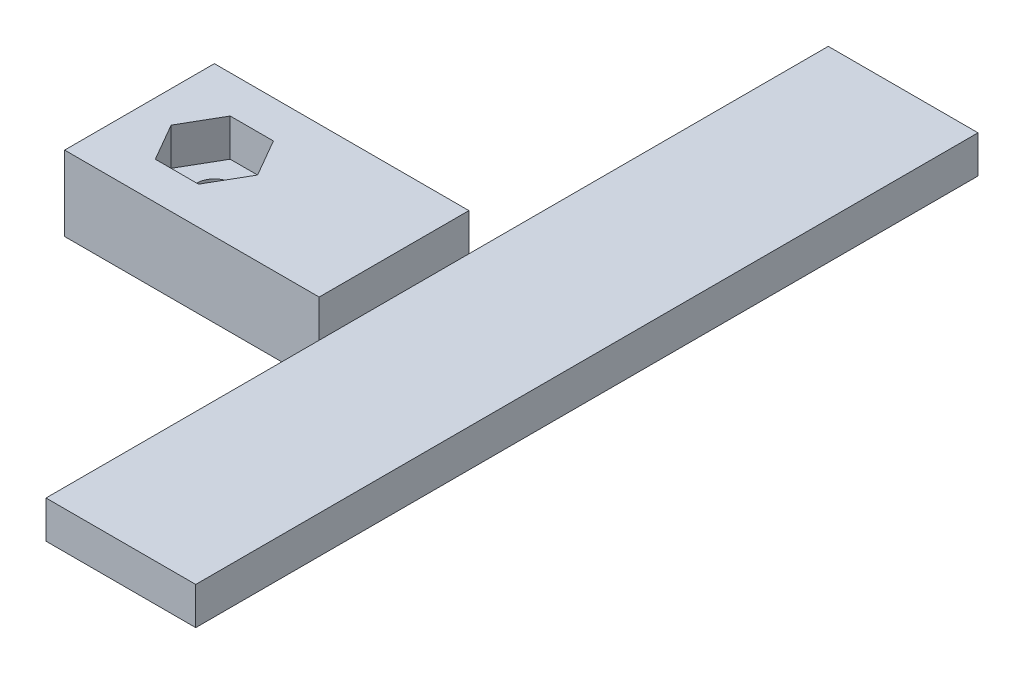
ISO-10303-21;
HEADER;
FILE_DESCRIPTION(('STEP AP214'),'2;1');
FILE_NAME('part.step','',(''),(''),'','','');
FILE_SCHEMA(('AUTOMOTIVE_DESIGN { 1 0 10303 214 1 1 1 1 }'));
ENDSEC;
DATA;
#1=APPLICATION_CONTEXT('core data for automotive mechanical design processes');
#2=APPLICATION_PROTOCOL_DEFINITION('international standard','automotive_design',2000,#1);
#3=PRODUCT_CONTEXT('',#1,'mechanical');
#4=PRODUCT('Part','Part','',(#3));
#5=PRODUCT_RELATED_PRODUCT_CATEGORY('part','',(#4));
#6=PRODUCT_DEFINITION_FORMATION('','',#4);
#7=PRODUCT_DEFINITION_CONTEXT('part definition',#1,'design');
#8=PRODUCT_DEFINITION('design','',#6,#7);
#9=PRODUCT_DEFINITION_SHAPE('','',#8);
#10=(LENGTH_UNIT() NAMED_UNIT(*) SI_UNIT(.MILLI.,.METRE.));
#11=(NAMED_UNIT(*) PLANE_ANGLE_UNIT() SI_UNIT($,.RADIAN.));
#12=(NAMED_UNIT(*) SI_UNIT($,.STERADIAN.) SOLID_ANGLE_UNIT());
#13=UNCERTAINTY_MEASURE_WITH_UNIT(LENGTH_MEASURE(1.E-05),#10,'distance_accuracy_value','');
#14=(GEOMETRIC_REPRESENTATION_CONTEXT(3) GLOBAL_UNCERTAINTY_ASSIGNED_CONTEXT((#13)) GLOBAL_UNIT_ASSIGNED_CONTEXT((#10,
#11,#12)) REPRESENTATION_CONTEXT('',''));
#15=CARTESIAN_POINT('',(0.,0.,0.));
#16=DIRECTION('',(0.,0.,1.));
#17=DIRECTION('',(1.,0.,0.));
#18=AXIS2_PLACEMENT_3D('',#15,#16,#17);
#19=CARTESIAN_POINT('',(4.44500000000001,3.175,0.));
#20=DIRECTION('',(1.,0.,0.));
#21=DIRECTION('',(0.,0.,-1.));
#22=AXIS2_PLACEMENT_3D('',#19,#20,#21);
#23=PLANE('',#22);
#24=DIRECTION('',(0.,0.,1.));
#25=VECTOR('',#24,1.);
#26=CARTESIAN_POINT('',(4.44500000000001,0.,0.));
#27=LINE('',#26,#25);
#28=CARTESIAN_POINT('',(4.44500000000001,0.,-6.35));
#29=VERTEX_POINT('',#28);
#30=CARTESIAN_POINT('',(4.44500000000001,0.,6.35));
#31=VERTEX_POINT('',#30);
#32=EDGE_CURVE('E214',#29,#31,#27,.T.);
#33=ORIENTED_EDGE('',*,*,#32,.F.);
#34=DIRECTION('',(0.,-1.,0.));
#35=VECTOR('',#34,1.);
#36=CARTESIAN_POINT('',(4.44500000000001,3.175,-6.35));
#37=LINE('',#36,#35);
#38=CARTESIAN_POINT('',(4.44500000000001,3.175,-6.35));
#39=VERTEX_POINT('',#38);
#40=EDGE_CURVE('E12',#39,#29,#37,.T.);
#41=ORIENTED_EDGE('',*,*,#40,.F.);
#42=DIRECTION('',(0.,0.,1.));
#43=VECTOR('',#42,1.);
#44=CARTESIAN_POINT('',(4.44500000000001,3.175,0.));
#45=LINE('',#44,#43);
#46=CARTESIAN_POINT('',(4.44500000000001,3.175,6.35));
#47=VERTEX_POINT('',#46);
#48=EDGE_CURVE('E165',#39,#47,#45,.T.);
#49=ORIENTED_EDGE('',*,*,#48,.T.);
#50=DIRECTION('',(0.,-1.,0.));
#51=VECTOR('',#50,1.);
#52=CARTESIAN_POINT('',(4.44500000000001,3.175,6.35));
#53=LINE('',#52,#51);
#54=EDGE_CURVE('E100',#47,#31,#53,.T.);
#55=ORIENTED_EDGE('',*,*,#54,.T.);
#56=EDGE_LOOP('',(#33,#41,#49,#55));
#57=FACE_BOUND('',#56,.T.);
#58=ADVANCED_FACE('F80',(#57),#23,.T.);
#59=CARTESIAN_POINT('',(0.,3.175,-6.35));
#60=DIRECTION('',(0.,0.,1.));
#61=DIRECTION('',(1.,0.,0.));
#62=AXIS2_PLACEMENT_3D('',#59,#60,#61);
#63=PLANE('',#62);
#64=ORIENTED_EDGE('',*,*,#40,.T.);
#65=DIRECTION('',(0.,1.,0.));
#66=VECTOR('',#65,1.);
#67=CARTESIAN_POINT('',(4.44500000000001,-3.175,-6.35));
#68=LINE('',#67,#66);
#69=CARTESIAN_POINT('',(4.44500000000001,-3.175,-6.35));
#70=VERTEX_POINT('',#69);
#71=EDGE_CURVE('E291',#70,#29,#68,.T.);
#72=ORIENTED_EDGE('',*,*,#71,.F.);
#73=DIRECTION('',(-1.,0.,0.));
#74=VECTOR('',#73,1.);
#75=CARTESIAN_POINT('',(17.145,-3.175,-6.35));
#76=LINE('',#75,#74);
#77=CARTESIAN_POINT('',(-17.145,-3.175,-6.35));
#78=VERTEX_POINT('',#77);
#79=EDGE_CURVE('E173',#70,#78,#76,.T.);
#80=ORIENTED_EDGE('',*,*,#79,.T.);
#81=DIRECTION('',(0.,-1.,0.));
#82=VECTOR('',#81,1.);
#83=CARTESIAN_POINT('',(-17.145,3.175,-6.35));
#84=LINE('',#83,#82);
#85=CARTESIAN_POINT('',(-17.145,3.175,-6.35));
#86=VERTEX_POINT('',#85);
#87=EDGE_CURVE('E91',#86,#78,#84,.T.);
#88=ORIENTED_EDGE('',*,*,#87,.F.);
#89=DIRECTION('',(-1.,0.,0.));
#90=VECTOR('',#89,1.);
#91=CARTESIAN_POINT('',(0.,3.175,-6.35));
#92=LINE('',#91,#90);
#93=EDGE_CURVE('E159',#39,#86,#92,.T.);
#94=ORIENTED_EDGE('',*,*,#93,.F.);
#95=EDGE_LOOP('',(#64,#72,#80,#88,#94));
#96=FACE_BOUND('',#95,.T.);
#97=ADVANCED_FACE('F170',(#96),#63,.F.);
#98=CARTESIAN_POINT('',(-17.145,3.175,0.));
#99=DIRECTION('',(-1.,0.,0.));
#100=DIRECTION('',(0.,0.,1.));
#101=AXIS2_PLACEMENT_3D('',#98,#99,#100);
#102=PLANE('',#101);
#103=ORIENTED_EDGE('',*,*,#87,.T.);
#104=DIRECTION('',(0.,0.,-1.));
#105=VECTOR('',#104,1.);
#106=CARTESIAN_POINT('',(-17.145,-3.175,6.35));
#107=LINE('',#106,#105);
#108=CARTESIAN_POINT('',(-17.145,-3.175,6.35));
#109=VERTEX_POINT('',#108);
#110=EDGE_CURVE('E286',#109,#78,#107,.T.);
#111=ORIENTED_EDGE('',*,*,#110,.F.);
#112=DIRECTION('',(0.,-1.,0.));
#113=VECTOR('',#112,1.);
#114=CARTESIAN_POINT('',(-17.145,3.175,6.35));
#115=LINE('',#114,#113);
#116=CARTESIAN_POINT('',(-17.145,3.175,6.35));
#117=VERTEX_POINT('',#116);
#118=EDGE_CURVE('E178',#117,#109,#115,.T.);
#119=ORIENTED_EDGE('',*,*,#118,.F.);
#120=DIRECTION('',(0.,0.,-1.));
#121=VECTOR('',#120,1.);
#122=CARTESIAN_POINT('',(-17.145,3.175,0.));
#123=LINE('',#122,#121);
#124=EDGE_CURVE('E164',#117,#86,#123,.T.);
#125=ORIENTED_EDGE('',*,*,#124,.T.);
#126=EDGE_LOOP('',(#103,#111,#119,#125));
#127=FACE_BOUND('',#126,.T.);
#128=ADVANCED_FACE('F180',(#127),#102,.T.);
#129=CARTESIAN_POINT('',(0.,3.175,3.175));
#130=DIRECTION('',(0.,0.,-1.));
#131=DIRECTION('',(-1.,0.,0.));
#132=AXIS2_PLACEMENT_3D('',#129,#130,#131);
#133=PLANE('',#132);
#134=DIRECTION('',(1.,0.,0.));
#135=VECTOR('',#134,1.);
#136=CARTESIAN_POINT('',(0.,0.,3.175));
#137=LINE('',#136,#135);
#138=CARTESIAN_POINT('',(-12.628087104677,0.,3.175));
#139=VERTEX_POINT('',#138);
#140=CARTESIAN_POINT('',(-8.96191289532293,0.,3.175));
#141=VERTEX_POINT('',#140);
#142=EDGE_CURVE('E189',#139,#141,#137,.T.);
#143=ORIENTED_EDGE('',*,*,#142,.F.);
#144=DIRECTION('',(0.,-1.,0.));
#145=VECTOR('',#144,1.);
#146=CARTESIAN_POINT('',(-12.628087104677,3.175,3.175));
#147=LINE('',#146,#145);
#148=CARTESIAN_POINT('',(-12.628087104677,3.175,3.175));
#149=VERTEX_POINT('',#148);
#150=EDGE_CURVE('E84',#149,#139,#147,.T.);
#151=ORIENTED_EDGE('',*,*,#150,.F.);
#152=DIRECTION('',(1.,0.,0.));
#153=VECTOR('',#152,1.);
#154=CARTESIAN_POINT('',(0.,3.175,3.175));
#155=LINE('',#154,#153);
#156=CARTESIAN_POINT('',(-8.96191289532293,3.175,3.175));
#157=VERTEX_POINT('',#156);
#158=EDGE_CURVE('E218',#149,#157,#155,.T.);
#159=ORIENTED_EDGE('',*,*,#158,.T.);
#160=DIRECTION('',(0.,-1.,0.));
#161=VECTOR('',#160,1.);
#162=CARTESIAN_POINT('',(-8.96191289532293,3.175,3.175));
#163=LINE('',#162,#161);
#164=EDGE_CURVE('E125',#157,#141,#163,.T.);
#165=ORIENTED_EDGE('',*,*,#164,.T.);
#166=EDGE_LOOP('',(#143,#151,#159,#165));
#167=FACE_BOUND('',#166,.T.);
#168=ADVANCED_FACE('F82',(#167),#133,.T.);
#169=CARTESIAN_POINT('',(-10.8458806570156,3.175,6.2618721169265));
#170=DIRECTION('',(0.866025403784439,0.,-0.5));
#171=DIRECTION('',(-0.5,0.,-0.866025403784439));
#172=AXIS2_PLACEMENT_3D('',#169,#170,#171);
#173=PLANE('',#172);
#174=DIRECTION('',(0.5,0.,0.866025403784439));
#175=VECTOR('',#174,1.);
#176=CARTESIAN_POINT('',(-10.8458806570156,0.,6.2618721169265));
#177=LINE('',#176,#175);
#178=CARTESIAN_POINT('',(-14.4611742093541,0.,0.));
#179=VERTEX_POINT('',#178);
#180=EDGE_CURVE('E193',#179,#139,#177,.T.);
#181=ORIENTED_EDGE('',*,*,#180,.F.);
#182=DIRECTION('',(0.,-1.,0.));
#183=VECTOR('',#182,1.);
#184=CARTESIAN_POINT('',(-14.4611742093541,3.175,0.));
#185=LINE('',#184,#183);
#186=CARTESIAN_POINT('',(-14.4611742093541,3.175,0.));
#187=VERTEX_POINT('',#186);
#188=EDGE_CURVE('E233',#187,#179,#185,.T.);
#189=ORIENTED_EDGE('',*,*,#188,.F.);
#190=DIRECTION('',(0.5,0.,0.866025403784439));
#191=VECTOR('',#190,1.);
#192=CARTESIAN_POINT('',(-10.8458806570156,3.175,6.2618721169265));
#193=LINE('',#192,#191);
#194=EDGE_CURVE('E244',#187,#149,#193,.T.);
#195=ORIENTED_EDGE('',*,*,#194,.T.);
#196=ORIENTED_EDGE('',*,*,#150,.T.);
#197=EDGE_LOOP('',(#181,#189,#195,#196));
#198=FACE_BOUND('',#197,.T.);
#199=ADVANCED_FACE('F242',(#198),#173,.T.);
#200=CARTESIAN_POINT('',(-10.8458806570156,3.175,-6.2618721169265));
#201=DIRECTION('',(0.866025403784439,0.,0.5));
#202=DIRECTION('',(0.5,0.,-0.866025403784439));
#203=AXIS2_PLACEMENT_3D('',#200,#201,#202);
#204=PLANE('',#203);
#205=DIRECTION('',(-0.5,0.,0.866025403784439));
#206=VECTOR('',#205,1.);
#207=CARTESIAN_POINT('',(-10.8458806570156,0.,-6.2618721169265));
#208=LINE('',#207,#206);
#209=CARTESIAN_POINT('',(-12.628087104677,0.,-3.175));
#210=VERTEX_POINT('',#209);
#211=EDGE_CURVE('E198',#210,#179,#208,.T.);
#212=ORIENTED_EDGE('',*,*,#211,.F.);
#213=DIRECTION('',(0.,-1.,0.));
#214=VECTOR('',#213,1.);
#215=CARTESIAN_POINT('',(-12.628087104677,3.175,-3.175));
#216=LINE('',#215,#214);
#217=CARTESIAN_POINT('',(-12.628087104677,3.175,-3.175));
#218=VERTEX_POINT('',#217);
#219=EDGE_CURVE('E231',#218,#210,#216,.T.);
#220=ORIENTED_EDGE('',*,*,#219,.F.);
#221=DIRECTION('',(-0.5,0.,0.866025403784439));
#222=VECTOR('',#221,1.);
#223=CARTESIAN_POINT('',(-10.8458806570156,3.175,-6.2618721169265));
#224=LINE('',#223,#222);
#225=EDGE_CURVE('E252',#218,#187,#224,.T.);
#226=ORIENTED_EDGE('',*,*,#225,.T.);
#227=ORIENTED_EDGE('',*,*,#188,.T.);
#228=EDGE_LOOP('',(#212,#220,#226,#227));
#229=FACE_BOUND('',#228,.T.);
#230=ADVANCED_FACE('F250',(#229),#204,.T.);
#231=CARTESIAN_POINT('',(0.,3.175,-3.175));
#232=DIRECTION('',(0.,0.,1.));
#233=DIRECTION('',(1.,0.,0.));
#234=AXIS2_PLACEMENT_3D('',#231,#232,#233);
#235=PLANE('',#234);
#236=DIRECTION('',(-1.,0.,0.));
#237=VECTOR('',#236,1.);
#238=CARTESIAN_POINT('',(0.,0.,-3.175));
#239=LINE('',#238,#237);
#240=CARTESIAN_POINT('',(-8.96191289532293,0.,-3.175));
#241=VERTEX_POINT('',#240);
#242=EDGE_CURVE('E202',#241,#210,#239,.T.);
#243=ORIENTED_EDGE('',*,*,#242,.F.);
#244=DIRECTION('',(0.,-1.,0.));
#245=VECTOR('',#244,1.);
#246=CARTESIAN_POINT('',(-8.96191289532293,3.175,-3.175));
#247=LINE('',#246,#245);
#248=CARTESIAN_POINT('',(-8.96191289532293,3.175,-3.175));
#249=VERTEX_POINT('',#248);
#250=EDGE_CURVE('E228',#249,#241,#247,.T.);
#251=ORIENTED_EDGE('',*,*,#250,.F.);
#252=DIRECTION('',(-1.,0.,0.));
#253=VECTOR('',#252,1.);
#254=CARTESIAN_POINT('',(0.,3.175,-3.175));
#255=LINE('',#254,#253);
#256=EDGE_CURVE('E258',#249,#218,#255,.T.);
#257=ORIENTED_EDGE('',*,*,#256,.T.);
#258=ORIENTED_EDGE('',*,*,#219,.T.);
#259=EDGE_LOOP('',(#243,#251,#257,#258));
#260=FACE_BOUND('',#259,.T.);
#261=ADVANCED_FACE('F262',(#260),#235,.T.);
#262=CARTESIAN_POINT('',(-5.3466193429844,3.175,3.0868721169265));
#263=DIRECTION('',(-0.866025403784439,0.,0.5));
#264=DIRECTION('',(0.5,0.,0.866025403784439));
#265=AXIS2_PLACEMENT_3D('',#262,#263,#264);
#266=PLANE('',#265);
#267=DIRECTION('',(-0.5,0.,-0.866025403784439));
#268=VECTOR('',#267,1.);
#269=CARTESIAN_POINT('',(-5.3466193429844,0.,3.0868721169265));
#270=LINE('',#269,#268);
#271=CARTESIAN_POINT('',(-7.12882579064586,0.,0.));
#272=VERTEX_POINT('',#271);
#273=EDGE_CURVE('E206',#272,#241,#270,.T.);
#274=ORIENTED_EDGE('',*,*,#273,.F.);
#275=DIRECTION('',(0.,-1.,0.));
#276=VECTOR('',#275,1.);
#277=CARTESIAN_POINT('',(-7.12882579064586,3.175,0.));
#278=LINE('',#277,#276);
#279=CARTESIAN_POINT('',(-7.12882579064586,3.175,0.));
#280=VERTEX_POINT('',#279);
#281=EDGE_CURVE('E225',#280,#272,#278,.T.);
#282=ORIENTED_EDGE('',*,*,#281,.F.);
#283=DIRECTION('',(-0.5,0.,-0.866025403784439));
#284=VECTOR('',#283,1.);
#285=CARTESIAN_POINT('',(-5.3466193429844,3.175,3.0868721169265));
#286=LINE('',#285,#284);
#287=EDGE_CURVE('E264',#280,#249,#286,.T.);
#288=ORIENTED_EDGE('',*,*,#287,.T.);
#289=ORIENTED_EDGE('',*,*,#250,.T.);
#290=EDGE_LOOP('',(#274,#282,#288,#289));
#291=FACE_BOUND('',#290,.T.);
#292=ADVANCED_FACE('F358',(#291),#266,.T.);
#293=CARTESIAN_POINT('',(-5.3466193429844,3.175,-3.0868721169265));
#294=DIRECTION('',(-0.866025403784439,0.,-0.5));
#295=DIRECTION('',(-0.5,0.,0.866025403784439));
#296=AXIS2_PLACEMENT_3D('',#293,#294,#295);
#297=PLANE('',#296);
#298=DIRECTION('',(0.5,0.,-0.866025403784439));
#299=VECTOR('',#298,1.);
#300=CARTESIAN_POINT('',(-5.3466193429844,0.,-3.0868721169265));
#301=LINE('',#300,#299);
#302=EDGE_CURVE('E210',#141,#272,#301,.T.);
#303=ORIENTED_EDGE('',*,*,#302,.F.);
#304=ORIENTED_EDGE('',*,*,#164,.F.);
#305=DIRECTION('',(0.5,0.,-0.866025403784439));
#306=VECTOR('',#305,1.);
#307=CARTESIAN_POINT('',(-5.3466193429844,3.175,-3.0868721169265));
#308=LINE('',#307,#306);
#309=EDGE_CURVE('E267',#157,#280,#308,.T.);
#310=ORIENTED_EDGE('',*,*,#309,.T.);
#311=ORIENTED_EDGE('',*,*,#281,.T.);
#312=EDGE_LOOP('',(#303,#304,#310,#311));
#313=FACE_BOUND('',#312,.T.);
#314=ADVANCED_FACE('F355',(#313),#297,.T.);
#315=CARTESIAN_POINT('',(0.,3.175,6.35));
#316=DIRECTION('',(0.,0.,1.));
#317=DIRECTION('',(1.,0.,0.));
#318=AXIS2_PLACEMENT_3D('',#315,#316,#317);
#319=PLANE('',#318);
#320=ORIENTED_EDGE('',*,*,#118,.T.);
#321=DIRECTION('',(-1.,0.,0.));
#322=VECTOR('',#321,1.);
#323=CARTESIAN_POINT('',(17.145,-3.175,6.35));
#324=LINE('',#323,#322);
#325=CARTESIAN_POINT('',(4.44500000000001,-3.175,6.35));
#326=VERTEX_POINT('',#325);
#327=EDGE_CURVE('E281',#326,#109,#324,.T.);
#328=ORIENTED_EDGE('',*,*,#327,.F.);
#329=DIRECTION('',(0.,1.,0.));
#330=VECTOR('',#329,1.);
#331=CARTESIAN_POINT('',(4.44500000000001,-3.175,6.35));
#332=LINE('',#331,#330);
#333=EDGE_CURVE('E194',#326,#31,#332,.T.);
#334=ORIENTED_EDGE('',*,*,#333,.T.);
#335=ORIENTED_EDGE('',*,*,#54,.F.);
#336=DIRECTION('',(-1.,0.,0.));
#337=VECTOR('',#336,1.);
#338=CARTESIAN_POINT('',(0.,3.175,6.35));
#339=LINE('',#338,#337);
#340=EDGE_CURVE('E183',#47,#117,#339,.T.);
#341=ORIENTED_EDGE('',*,*,#340,.T.);
#342=EDGE_LOOP('',(#320,#328,#334,#335,#341));
#343=FACE_BOUND('',#342,.T.);
#344=ADVANCED_FACE('F276',(#343),#319,.T.);
#345=CARTESIAN_POINT('',(0.,3.175,0.));
#346=DIRECTION('',(0.,1.,0.));
#347=DIRECTION('',(0.,0.,1.));
#348=AXIS2_PLACEMENT_3D('',#345,#346,#347);
#349=PLANE('',#348);
#350=ORIENTED_EDGE('',*,*,#158,.F.);
#351=ORIENTED_EDGE('',*,*,#194,.F.);
#352=ORIENTED_EDGE('',*,*,#225,.F.);
#353=ORIENTED_EDGE('',*,*,#256,.F.);
#354=ORIENTED_EDGE('',*,*,#287,.F.);
#355=ORIENTED_EDGE('',*,*,#309,.F.);
#356=EDGE_LOOP('',(#350,#351,#352,#353,#354,#355));
#357=FACE_BOUND('',#356,.T.);
#358=ORIENTED_EDGE('',*,*,#48,.F.);
#359=ORIENTED_EDGE('',*,*,#93,.T.);
#360=ORIENTED_EDGE('',*,*,#124,.F.);
#361=ORIENTED_EDGE('',*,*,#340,.F.);
#362=EDGE_LOOP('',(#358,#359,#360,#361));
#363=FACE_BOUND('',#362,.T.);
#364=ADVANCED_FACE('F161',(#357,#363),#349,.T.);
#365=CARTESIAN_POINT('',(0.,0.,0.));
#366=DIRECTION('',(0.,1.,0.));
#367=DIRECTION('',(0.,0.,1.));
#368=AXIS2_PLACEMENT_3D('',#365,#366,#367);
#369=PLANE('',#368);
#370=ORIENTED_EDGE('',*,*,#180,.T.);
#371=ORIENTED_EDGE('',*,*,#142,.T.);
#372=ORIENTED_EDGE('',*,*,#302,.T.);
#373=ORIENTED_EDGE('',*,*,#273,.T.);
#374=ORIENTED_EDGE('',*,*,#242,.T.);
#375=ORIENTED_EDGE('',*,*,#211,.T.);
#376=EDGE_LOOP('',(#370,#371,#372,#373,#374,#375));
#377=FACE_BOUND('',#376,.T.);
#378=CARTESIAN_POINT('',(-10.795,0.,0.));
#379=DIRECTION('',(0.,1.,0.));
#380=DIRECTION('',(0.,0.,1.));
#381=AXIS2_PLACEMENT_3D('',#378,#379,#380);
#382=CIRCLE('',#381,1.5);
#383=CARTESIAN_POINT('',(-10.795,0.,1.5));
#384=VERTEX_POINT('',#383);
#385=EDGE_CURVE('E334',#384,#384,#382,.T.);
#386=ORIENTED_EDGE('',*,*,#385,.F.);
#387=EDGE_LOOP('',(#386));
#388=FACE_BOUND('',#387,.T.);
#389=ADVANCED_FACE('F247',(#377,#388),#369,.T.);
#390=CARTESIAN_POINT('',(17.145,-3.175,6.35));
#391=DIRECTION('',(1.,0.,0.));
#392=DIRECTION('',(0.,0.,-1.));
#393=AXIS2_PLACEMENT_3D('',#390,#391,#392);
#394=PLANE('',#393);
#395=DIRECTION('',(0.,0.,-1.));
#396=VECTOR('',#395,1.);
#397=CARTESIAN_POINT('',(17.145,0.,6.35));
#398=LINE('',#397,#396);
#399=CARTESIAN_POINT('',(17.145,0.,29.52));
#400=VERTEX_POINT('',#399);
#401=CARTESIAN_POINT('',(17.145,0.,-36.83));
#402=VERTEX_POINT('',#401);
#403=EDGE_CURVE('E300',#400,#402,#398,.T.);
#404=ORIENTED_EDGE('',*,*,#403,.F.);
#405=DIRECTION('',(0.,1.,0.));
#406=VECTOR('',#405,1.);
#407=CARTESIAN_POINT('',(17.145,-3.175,29.52));
#408=LINE('',#407,#406);
#409=CARTESIAN_POINT('',(17.145,-3.175,29.52));
#410=VERTEX_POINT('',#409);
#411=EDGE_CURVE('E335',#410,#400,#408,.T.);
#412=ORIENTED_EDGE('',*,*,#411,.F.);
#413=DIRECTION('',(0.,0.,-1.));
#414=VECTOR('',#413,1.);
#415=CARTESIAN_POINT('',(17.145,-3.175,6.35));
#416=LINE('',#415,#414);
#417=CARTESIAN_POINT('',(17.145,-3.175,-36.83));
#418=VERTEX_POINT('',#417);
#419=EDGE_CURVE('E296',#410,#418,#416,.T.);
#420=ORIENTED_EDGE('',*,*,#419,.T.);
#421=DIRECTION('',(0.,1.,0.));
#422=VECTOR('',#421,1.);
#423=CARTESIAN_POINT('',(17.145,-3.175,-36.83));
#424=LINE('',#423,#422);
#425=EDGE_CURVE('E330',#418,#402,#424,.T.);
#426=ORIENTED_EDGE('',*,*,#425,.T.);
#427=EDGE_LOOP('',(#404,#412,#420,#426));
#428=FACE_BOUND('',#427,.T.);
#429=ADVANCED_FACE('F385',(#428),#394,.T.);
#430=CARTESIAN_POINT('',(-10.795,-3.175,0.));
#431=DIRECTION('',(0.,1.,0.));
#432=DIRECTION('',(0.,0.,1.));
#433=AXIS2_PLACEMENT_3D('',#430,#431,#432);
#434=CYLINDRICAL_SURFACE('',#433,1.5);
#435=CARTESIAN_POINT('',(-10.795,-3.175,0.));
#436=DIRECTION('',(0.,1.,0.));
#437=DIRECTION('',(0.,0.,1.));
#438=AXIS2_PLACEMENT_3D('',#435,#436,#437);
#439=CIRCLE('',#438,1.5);
#440=CARTESIAN_POINT('',(-10.795,-3.175,1.5));
#441=VERTEX_POINT('',#440);
#442=EDGE_CURVE('E304',#441,#441,#439,.T.);
#443=ORIENTED_EDGE('',*,*,#442,.F.);
#444=EDGE_LOOP('',(#443));
#445=FACE_BOUND('',#444,.T.);
#446=ORIENTED_EDGE('',*,*,#385,.T.);
#447=EDGE_LOOP('',(#446));
#448=FACE_BOUND('',#447,.T.);
#449=ADVANCED_FACE('F396',(#445,#448),#434,.F.);
#450=DIRECTION('',(0.,0.,1.));
#451=VECTOR('',#450,1.);
#452=CARTESIAN_POINT('',(4.44500000000001,0.,-36.83));
#453=LINE('',#452,#451);
#454=CARTESIAN_POINT('',(4.44500000000001,0.,-36.83));
#455=VERTEX_POINT('',#454);
#456=EDGE_CURVE('E323',#455,#29,#453,.T.);
#457=ORIENTED_EDGE('',*,*,#456,.T.);
#458=ORIENTED_EDGE('',*,*,#32,.T.);
#459=CARTESIAN_POINT('',(4.44500000000002,0.,29.52));
#460=VERTEX_POINT('',#459);
#461=EDGE_CURVE('E322',#31,#460,#453,.T.);
#462=ORIENTED_EDGE('',*,*,#461,.T.);
#463=DIRECTION('',(-1.,0.,0.));
#464=VECTOR('',#463,1.);
#465=CARTESIAN_POINT('',(17.145,0.,29.52));
#466=LINE('',#465,#464);
#467=EDGE_CURVE('E309',#400,#460,#466,.T.);
#468=ORIENTED_EDGE('',*,*,#467,.F.);
#469=ORIENTED_EDGE('',*,*,#403,.T.);
#470=DIRECTION('',(-1.,0.,0.));
#471=VECTOR('',#470,1.);
#472=CARTESIAN_POINT('',(17.145,0.,-36.83));
#473=LINE('',#472,#471);
#474=EDGE_CURVE('E318',#402,#455,#473,.T.);
#475=ORIENTED_EDGE('',*,*,#474,.T.);
#476=EDGE_LOOP('',(#457,#458,#462,#468,#469,#475));
#477=FACE_BOUND('',#476,.T.);
#478=ADVANCED_FACE('F398',(#477),#369,.T.);
#479=CARTESIAN_POINT('',(0.,-3.175,0.));
#480=DIRECTION('',(0.,1.,0.));
#481=DIRECTION('',(0.,0.,1.));
#482=AXIS2_PLACEMENT_3D('',#479,#480,#481);
#483=PLANE('',#482);
#484=ORIENTED_EDGE('',*,*,#442,.T.);
#485=EDGE_LOOP('',(#484));
#486=FACE_BOUND('',#485,.T.);
#487=ORIENTED_EDGE('',*,*,#79,.F.);
#488=DIRECTION('',(0.,0.,1.));
#489=VECTOR('',#488,1.);
#490=CARTESIAN_POINT('',(4.44500000000001,-3.175,-36.83));
#491=LINE('',#490,#489);
#492=CARTESIAN_POINT('',(4.44500000000001,-3.175,-36.83));
#493=VERTEX_POINT('',#492);
#494=EDGE_CURVE('E310',#493,#70,#491,.T.);
#495=ORIENTED_EDGE('',*,*,#494,.F.);
#496=DIRECTION('',(-1.,0.,0.));
#497=VECTOR('',#496,1.);
#498=CARTESIAN_POINT('',(17.145,-3.175,-36.83));
#499=LINE('',#498,#497);
#500=EDGE_CURVE('E305',#418,#493,#499,.T.);
#501=ORIENTED_EDGE('',*,*,#500,.F.);
#502=ORIENTED_EDGE('',*,*,#419,.F.);
#503=DIRECTION('',(-1.,0.,0.));
#504=VECTOR('',#503,1.);
#505=CARTESIAN_POINT('',(17.145,-3.175,29.52));
#506=LINE('',#505,#504);
#507=CARTESIAN_POINT('',(4.44500000000002,-3.175,29.52));
#508=VERTEX_POINT('',#507);
#509=EDGE_CURVE('E314',#410,#508,#506,.T.);
#510=ORIENTED_EDGE('',*,*,#509,.T.);
#511=EDGE_CURVE('E289',#326,#508,#491,.T.);
#512=ORIENTED_EDGE('',*,*,#511,.F.);
#513=ORIENTED_EDGE('',*,*,#327,.T.);
#514=ORIENTED_EDGE('',*,*,#110,.T.);
#515=EDGE_LOOP('',(#487,#495,#501,#502,#510,#512,#513,#514));
#516=FACE_BOUND('',#515,.T.);
#517=ADVANCED_FACE('F285',(#486,#516),#483,.F.);
#518=CARTESIAN_POINT('',(17.145,-3.175,-36.83));
#519=DIRECTION('',(0.,0.,-1.));
#520=DIRECTION('',(-1.,0.,0.));
#521=AXIS2_PLACEMENT_3D('',#518,#519,#520);
#522=PLANE('',#521);
#523=ORIENTED_EDGE('',*,*,#474,.F.);
#524=ORIENTED_EDGE('',*,*,#425,.F.);
#525=ORIENTED_EDGE('',*,*,#500,.T.);
#526=DIRECTION('',(0.,1.,0.));
#527=VECTOR('',#526,1.);
#528=CARTESIAN_POINT('',(4.44500000000001,-3.175,-36.83));
#529=LINE('',#528,#527);
#530=EDGE_CURVE('E317',#493,#455,#529,.T.);
#531=ORIENTED_EDGE('',*,*,#530,.T.);
#532=EDGE_LOOP('',(#523,#524,#525,#531));
#533=FACE_BOUND('',#532,.T.);
#534=ADVANCED_FACE('F380',(#533),#522,.T.);
#535=CARTESIAN_POINT('',(4.44500000000001,-3.175,-36.83));
#536=DIRECTION('',(-1.,0.,0.));
#537=DIRECTION('',(0.,0.,1.));
#538=AXIS2_PLACEMENT_3D('',#535,#536,#537);
#539=PLANE('',#538);
#540=ORIENTED_EDGE('',*,*,#494,.T.);
#541=ORIENTED_EDGE('',*,*,#71,.T.);
#542=ORIENTED_EDGE('',*,*,#456,.F.);
#543=ORIENTED_EDGE('',*,*,#530,.F.);
#544=EDGE_LOOP('',(#540,#541,#542,#543));
#545=FACE_BOUND('',#544,.T.);
#546=ADVANCED_FACE('F383',(#545),#539,.T.);
#547=CARTESIAN_POINT('',(17.145,-3.175,29.52));
#548=DIRECTION('',(0.,0.,-1.));
#549=DIRECTION('',(-1.,0.,0.));
#550=AXIS2_PLACEMENT_3D('',#547,#548,#549);
#551=PLANE('',#550);
#552=ORIENTED_EDGE('',*,*,#467,.T.);
#553=DIRECTION('',(0.,1.,0.));
#554=VECTOR('',#553,1.);
#555=CARTESIAN_POINT('',(4.44500000000002,-3.175,29.52));
#556=LINE('',#555,#554);
#557=EDGE_CURVE('E339',#508,#460,#556,.T.);
#558=ORIENTED_EDGE('',*,*,#557,.F.);
#559=ORIENTED_EDGE('',*,*,#509,.F.);
#560=ORIENTED_EDGE('',*,*,#411,.T.);
#561=EDGE_LOOP('',(#552,#558,#559,#560));
#562=FACE_BOUND('',#561,.T.);
#563=ADVANCED_FACE('F388',(#562),#551,.F.);
#564=ORIENTED_EDGE('',*,*,#333,.F.);
#565=ORIENTED_EDGE('',*,*,#511,.T.);
#566=ORIENTED_EDGE('',*,*,#557,.T.);
#567=ORIENTED_EDGE('',*,*,#461,.F.);
#568=EDGE_LOOP('',(#564,#565,#566,#567));
#569=FACE_BOUND('',#568,.T.);
#570=ADVANCED_FACE('F390',(#569),#539,.T.);
#571=CLOSED_SHELL('',(#58,#97,#128,#168,#199,#230,#261,#292,#314,#344,#364,#389,#429,#449,#478,
#517,#534,#546,#563,#570));
#572=MANIFOLD_SOLID_BREP('B2',#571);
#573=ADVANCED_BREP_SHAPE_REPRESENTATION('',(#18,#572),#14);
#574=SHAPE_DEFINITION_REPRESENTATION(#9,#573);
ENDSEC;
END-ISO-10303-21;
